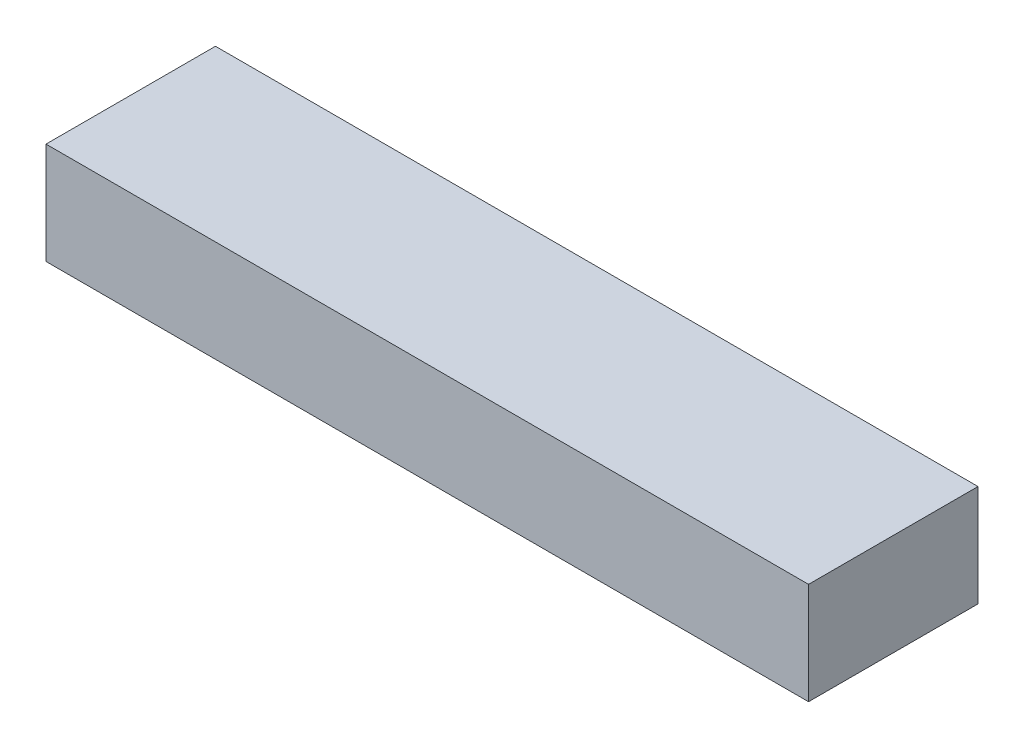
ISO-10303-21;
HEADER;
FILE_DESCRIPTION(('STEP AP214'),'2;1');
FILE_NAME('part.step','',(''),(''),'','','');
FILE_SCHEMA(('AUTOMOTIVE_DESIGN { 1 0 10303 214 1 1 1 1 }'));
ENDSEC;
DATA;
#1=APPLICATION_CONTEXT('core data for automotive mechanical design processes');
#2=APPLICATION_PROTOCOL_DEFINITION('international standard','automotive_design',2000,#1);
#3=PRODUCT_CONTEXT('',#1,'mechanical');
#4=PRODUCT('Part','Part','',(#3));
#5=PRODUCT_RELATED_PRODUCT_CATEGORY('part','',(#4));
#6=PRODUCT_DEFINITION_FORMATION('','',#4);
#7=PRODUCT_DEFINITION_CONTEXT('part definition',#1,'design');
#8=PRODUCT_DEFINITION('design','',#6,#7);
#9=PRODUCT_DEFINITION_SHAPE('','',#8);
#10=(LENGTH_UNIT() NAMED_UNIT(*) SI_UNIT(.MILLI.,.METRE.));
#11=(NAMED_UNIT(*) PLANE_ANGLE_UNIT() SI_UNIT($,.RADIAN.));
#12=(NAMED_UNIT(*) SI_UNIT($,.STERADIAN.) SOLID_ANGLE_UNIT());
#13=UNCERTAINTY_MEASURE_WITH_UNIT(LENGTH_MEASURE(1.E-05),#10,'distance_accuracy_value','');
#14=(GEOMETRIC_REPRESENTATION_CONTEXT(3) GLOBAL_UNCERTAINTY_ASSIGNED_CONTEXT((#13)) GLOBAL_UNIT_ASSIGNED_CONTEXT((#10,
#11,#12)) REPRESENTATION_CONTEXT('',''));
#15=CARTESIAN_POINT('',(0.,0.,0.));
#16=DIRECTION('',(0.,0.,1.));
#17=DIRECTION('',(1.,0.,0.));
#18=AXIS2_PLACEMENT_3D('',#15,#16,#17);
#19=CARTESIAN_POINT('',(-24.656652360515,6.,5.20386266094421));
#20=DIRECTION('',(1.,0.,0.));
#21=DIRECTION('',(0.,0.,-1.));
#22=AXIS2_PLACEMENT_3D('',#19,#20,#21);
#23=PLANE('',#22);
#24=DIRECTION('',(0.,0.,1.));
#25=VECTOR('',#24,1.);
#26=CARTESIAN_POINT('',(-24.656652360515,0.,5.20386266094421));
#27=LINE('',#26,#25);
#28=CARTESIAN_POINT('',(-24.656652360515,0.,-4.79613733905579));
#29=VERTEX_POINT('',#28);
#30=CARTESIAN_POINT('',(-24.656652360515,0.,5.20386266094421));
#31=VERTEX_POINT('',#30);
#32=EDGE_CURVE('E102',#29,#31,#27,.T.);
#33=ORIENTED_EDGE('',*,*,#32,.T.);
#34=DIRECTION('',(0.,-1.,0.));
#35=VECTOR('',#34,1.);
#36=CARTESIAN_POINT('',(-24.656652360515,6.,5.20386266094421));
#37=LINE('',#36,#35);
#38=CARTESIAN_POINT('',(-24.656652360515,6.,5.20386266094421));
#39=VERTEX_POINT('',#38);
#40=EDGE_CURVE('E11',#39,#31,#37,.T.);
#41=ORIENTED_EDGE('',*,*,#40,.F.);
#42=DIRECTION('',(0.,0.,1.));
#43=VECTOR('',#42,1.);
#44=CARTESIAN_POINT('',(-24.656652360515,6.,5.20386266094421));
#45=LINE('',#44,#43);
#46=CARTESIAN_POINT('',(-24.656652360515,6.,-4.79613733905579));
#47=VERTEX_POINT('',#46);
#48=EDGE_CURVE('E90',#47,#39,#45,.T.);
#49=ORIENTED_EDGE('',*,*,#48,.F.);
#50=DIRECTION('',(0.,-1.,0.));
#51=VECTOR('',#50,1.);
#52=CARTESIAN_POINT('',(-24.656652360515,6.,-4.79613733905579));
#53=LINE('',#52,#51);
#54=EDGE_CURVE('E98',#47,#29,#53,.T.);
#55=ORIENTED_EDGE('',*,*,#54,.T.);
#56=EDGE_LOOP('',(#33,#41,#49,#55));
#57=FACE_BOUND('',#56,.T.);
#58=ADVANCED_FACE('F39',(#57),#23,.F.);
#59=CARTESIAN_POINT('',(-24.656652360515,6.,5.20386266094421));
#60=DIRECTION('',(0.,0.,-1.));
#61=DIRECTION('',(-1.,0.,0.));
#62=AXIS2_PLACEMENT_3D('',#59,#60,#61);
#63=PLANE('',#62);
#64=DIRECTION('',(1.,0.,0.));
#65=VECTOR('',#64,1.);
#66=CARTESIAN_POINT('',(-24.656652360515,0.,5.20386266094421));
#67=LINE('',#66,#65);
#68=CARTESIAN_POINT('',(20.343347639485,0.,5.20386266094421));
#69=VERTEX_POINT('',#68);
#70=EDGE_CURVE('E94',#31,#69,#67,.T.);
#71=ORIENTED_EDGE('',*,*,#70,.T.);
#72=DIRECTION('',(0.,-1.,0.));
#73=VECTOR('',#72,1.);
#74=CARTESIAN_POINT('',(20.343347639485,6.,5.20386266094421));
#75=LINE('',#74,#73);
#76=CARTESIAN_POINT('',(20.343347639485,6.,5.20386266094421));
#77=VERTEX_POINT('',#76);
#78=EDGE_CURVE('E47',#77,#69,#75,.T.);
#79=ORIENTED_EDGE('',*,*,#78,.F.);
#80=DIRECTION('',(1.,0.,0.));
#81=VECTOR('',#80,1.);
#82=CARTESIAN_POINT('',(-24.656652360515,6.,5.20386266094421));
#83=LINE('',#82,#81);
#84=EDGE_CURVE('E85',#39,#77,#83,.T.);
#85=ORIENTED_EDGE('',*,*,#84,.F.);
#86=ORIENTED_EDGE('',*,*,#40,.T.);
#87=EDGE_LOOP('',(#71,#79,#85,#86));
#88=FACE_BOUND('',#87,.T.);
#89=ADVANCED_FACE('F93',(#88),#63,.F.);
#90=CARTESIAN_POINT('',(20.343347639485,6.,5.20386266094421));
#91=DIRECTION('',(-1.,0.,0.));
#92=DIRECTION('',(0.,0.,1.));
#93=AXIS2_PLACEMENT_3D('',#90,#91,#92);
#94=PLANE('',#93);
#95=DIRECTION('',(0.,0.,-1.));
#96=VECTOR('',#95,1.);
#97=CARTESIAN_POINT('',(20.343347639485,0.,5.20386266094421));
#98=LINE('',#97,#96);
#99=CARTESIAN_POINT('',(20.343347639485,0.,-4.79613733905579));
#100=VERTEX_POINT('',#99);
#101=EDGE_CURVE('E72',#69,#100,#98,.T.);
#102=ORIENTED_EDGE('',*,*,#101,.T.);
#103=DIRECTION('',(0.,-1.,0.));
#104=VECTOR('',#103,1.);
#105=CARTESIAN_POINT('',(20.343347639485,6.,-4.79613733905579));
#106=LINE('',#105,#104);
#107=CARTESIAN_POINT('',(20.343347639485,6.,-4.79613733905579));
#108=VERTEX_POINT('',#107);
#109=EDGE_CURVE('E95',#108,#100,#106,.T.);
#110=ORIENTED_EDGE('',*,*,#109,.F.);
#111=DIRECTION('',(0.,0.,-1.));
#112=VECTOR('',#111,1.);
#113=CARTESIAN_POINT('',(20.343347639485,6.,5.20386266094421));
#114=LINE('',#113,#112);
#115=EDGE_CURVE('E88',#77,#108,#114,.T.);
#116=ORIENTED_EDGE('',*,*,#115,.F.);
#117=ORIENTED_EDGE('',*,*,#78,.T.);
#118=EDGE_LOOP('',(#102,#110,#116,#117));
#119=FACE_BOUND('',#118,.T.);
#120=ADVANCED_FACE('F96',(#119),#94,.F.);
#121=CARTESIAN_POINT('',(-24.656652360515,6.,-4.79613733905579));
#122=DIRECTION('',(0.,0.,1.));
#123=DIRECTION('',(1.,0.,0.));
#124=AXIS2_PLACEMENT_3D('',#121,#122,#123);
#125=PLANE('',#124);
#126=DIRECTION('',(-1.,0.,0.));
#127=VECTOR('',#126,1.);
#128=CARTESIAN_POINT('',(-24.656652360515,0.,-4.79613733905579));
#129=LINE('',#128,#127);
#130=EDGE_CURVE('E78',#100,#29,#129,.T.);
#131=ORIENTED_EDGE('',*,*,#130,.T.);
#132=ORIENTED_EDGE('',*,*,#54,.F.);
#133=DIRECTION('',(-1.,0.,0.));
#134=VECTOR('',#133,1.);
#135=CARTESIAN_POINT('',(-24.656652360515,6.,-4.79613733905579));
#136=LINE('',#135,#134);
#137=EDGE_CURVE('E55',#108,#47,#136,.T.);
#138=ORIENTED_EDGE('',*,*,#137,.F.);
#139=ORIENTED_EDGE('',*,*,#109,.T.);
#140=EDGE_LOOP('',(#131,#132,#138,#139));
#141=FACE_BOUND('',#140,.T.);
#142=ADVANCED_FACE('F109',(#141),#125,.F.);
#143=CARTESIAN_POINT('',(0.,6.,0.));
#144=DIRECTION('',(0.,-1.,0.));
#145=DIRECTION('',(0.,0.,-1.));
#146=AXIS2_PLACEMENT_3D('',#143,#144,#145);
#147=PLANE('',#146);
#148=ORIENTED_EDGE('',*,*,#48,.T.);
#149=ORIENTED_EDGE('',*,*,#84,.T.);
#150=ORIENTED_EDGE('',*,*,#115,.T.);
#151=ORIENTED_EDGE('',*,*,#137,.T.);
#152=EDGE_LOOP('',(#148,#149,#150,#151));
#153=FACE_BOUND('',#152,.T.);
#154=ADVANCED_FACE('F86',(#153),#147,.F.);
#155=CARTESIAN_POINT('',(0.,0.,0.));
#156=DIRECTION('',(0.,-1.,0.));
#157=DIRECTION('',(0.,0.,-1.));
#158=AXIS2_PLACEMENT_3D('',#155,#156,#157);
#159=PLANE('',#158);
#160=ORIENTED_EDGE('',*,*,#32,.F.);
#161=ORIENTED_EDGE('',*,*,#130,.F.);
#162=ORIENTED_EDGE('',*,*,#101,.F.);
#163=ORIENTED_EDGE('',*,*,#70,.F.);
#164=EDGE_LOOP('',(#160,#161,#162,#163));
#165=FACE_BOUND('',#164,.T.);
#166=ADVANCED_FACE('F112',(#165),#159,.T.);
#167=CLOSED_SHELL('',(#58,#89,#120,#142,#154,#166));
#168=MANIFOLD_SOLID_BREP('B2',#167);
#169=ADVANCED_BREP_SHAPE_REPRESENTATION('',(#18,#168),#14);
#170=SHAPE_DEFINITION_REPRESENTATION(#9,#169);
ENDSEC;
END-ISO-10303-21;
